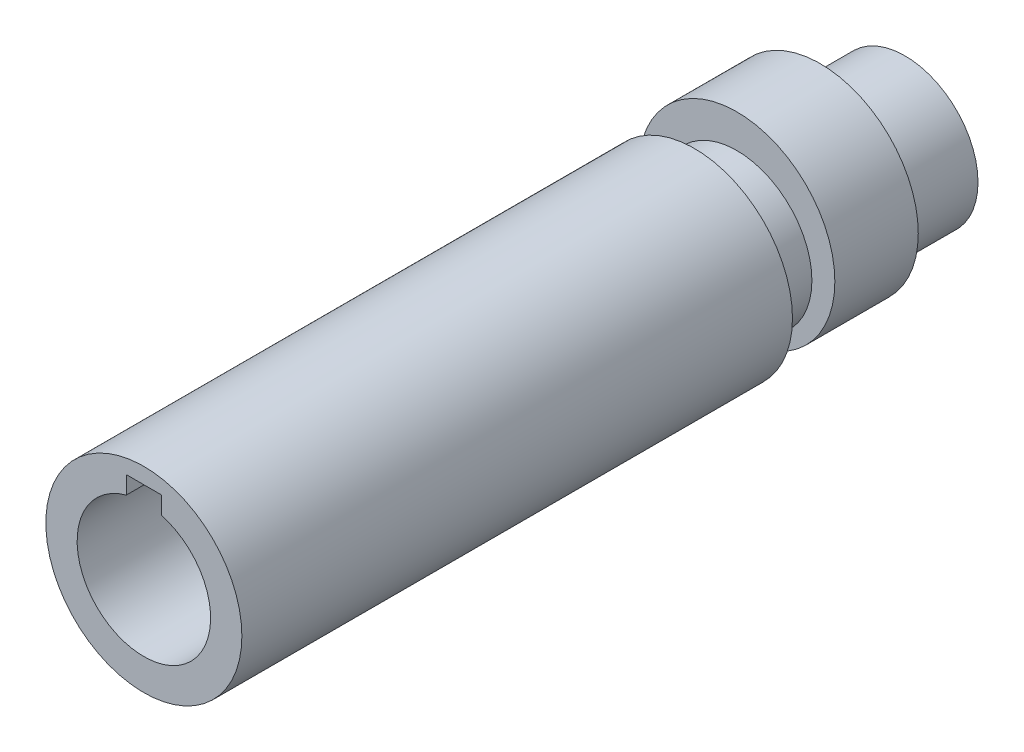
ISO-10303-21;
HEADER;
FILE_DESCRIPTION(('STEP AP214'),'2;1');
FILE_NAME('part.step','',(''),(''),'','','');
FILE_SCHEMA(('AUTOMOTIVE_DESIGN { 1 0 10303 214 1 1 1 1 }'));
ENDSEC;
DATA;
#1=APPLICATION_CONTEXT('core data for automotive mechanical design processes');
#2=APPLICATION_PROTOCOL_DEFINITION('international standard','automotive_design',2000,#1);
#3=PRODUCT_CONTEXT('',#1,'mechanical');
#4=PRODUCT('Part','Part','',(#3));
#5=PRODUCT_RELATED_PRODUCT_CATEGORY('part','',(#4));
#6=PRODUCT_DEFINITION_FORMATION('','',#4);
#7=PRODUCT_DEFINITION_CONTEXT('part definition',#1,'design');
#8=PRODUCT_DEFINITION('design','',#6,#7);
#9=PRODUCT_DEFINITION_SHAPE('','',#8);
#10=(LENGTH_UNIT() NAMED_UNIT(*) SI_UNIT(.MILLI.,.METRE.));
#11=(NAMED_UNIT(*) PLANE_ANGLE_UNIT() SI_UNIT($,.RADIAN.));
#12=(NAMED_UNIT(*) SI_UNIT($,.STERADIAN.) SOLID_ANGLE_UNIT());
#13=UNCERTAINTY_MEASURE_WITH_UNIT(LENGTH_MEASURE(1.E-05),#10,'distance_accuracy_value','');
#14=(GEOMETRIC_REPRESENTATION_CONTEXT(3) GLOBAL_UNCERTAINTY_ASSIGNED_CONTEXT((#13)) GLOBAL_UNIT_ASSIGNED_CONTEXT((#10,
#11,#12)) REPRESENTATION_CONTEXT('',''));
#15=CARTESIAN_POINT('',(0.,0.,0.));
#16=DIRECTION('',(0.,0.,1.));
#17=DIRECTION('',(1.,0.,0.));
#18=AXIS2_PLACEMENT_3D('',#15,#16,#17);
#19=CARTESIAN_POINT('',(0.,0.,0.));
#20=DIRECTION('',(0.,0.,-1.));
#21=DIRECTION('',(1.,0.,0.));
#22=AXIS2_PLACEMENT_3D('',#19,#20,#21);
#23=PLANE('',#22);
#24=CARTESIAN_POINT('',(0.,0.,0.));
#25=DIRECTION('',(0.,0.,1.));
#26=DIRECTION('',(1.,0.,0.));
#27=AXIS2_PLACEMENT_3D('',#24,#25,#26);
#28=CIRCLE('',#27,5.875);
#29=CARTESIAN_POINT('',(5.875,0.,0.));
#30=VERTEX_POINT('',#29);
#31=EDGE_CURVE('E49',#30,#30,#28,.T.);
#32=ORIENTED_EDGE('',*,*,#31,.T.);
#33=EDGE_LOOP('',(#32));
#34=FACE_BOUND('',#33,.T.);
#35=DIRECTION('',(0.,1.,0.));
#36=VECTOR('',#35,1.);
#37=CARTESIAN_POINT('',(1.05,0.,0.));
#38=LINE('',#37,#36);
#39=CARTESIAN_POINT('',(1.05,3.85972796968906,0.));
#40=VERTEX_POINT('',#39);
#41=CARTESIAN_POINT('',(1.05,4.91972796968906,0.));
#42=VERTEX_POINT('',#41);
#43=EDGE_CURVE('E281',#40,#42,#38,.T.);
#44=ORIENTED_EDGE('',*,*,#43,.F.);
#45=CARTESIAN_POINT('',(0.,0.,0.));
#46=DIRECTION('',(0.,0.,-1.));
#47=DIRECTION('',(-1.,0.,0.));
#48=AXIS2_PLACEMENT_3D('',#45,#46,#47);
#49=CIRCLE('',#48,4.);
#50=CARTESIAN_POINT('',(-1.05,3.85972796968906,0.));
#51=VERTEX_POINT('',#50);
#52=EDGE_CURVE('E279',#40,#51,#49,.T.);
#53=ORIENTED_EDGE('',*,*,#52,.T.);
#54=DIRECTION('',(0.,1.,0.));
#55=VECTOR('',#54,1.);
#56=CARTESIAN_POINT('',(-1.05,0.,0.));
#57=LINE('',#56,#55);
#58=CARTESIAN_POINT('',(-1.05,4.91972796968906,0.));
#59=VERTEX_POINT('',#58);
#60=EDGE_CURVE('E108',#51,#59,#57,.T.);
#61=ORIENTED_EDGE('',*,*,#60,.T.);
#62=DIRECTION('',(-1.,0.,0.));
#63=VECTOR('',#62,1.);
#64=CARTESIAN_POINT('',(0.,4.91972796968906,0.));
#65=LINE('',#64,#63);
#66=EDGE_CURVE('E276',#42,#59,#65,.T.);
#67=ORIENTED_EDGE('',*,*,#66,.F.);
#68=EDGE_LOOP('',(#44,#53,#61,#67));
#69=FACE_BOUND('',#68,.T.);
#70=ADVANCED_FACE('F45',(#34,#69),#23,.F.);
#71=CARTESIAN_POINT('',(0.,0.,-33.));
#72=DIRECTION('',(0.,0.,1.));
#73=DIRECTION('',(-1.,0.,0.));
#74=AXIS2_PLACEMENT_3D('',#71,#72,#73);
#75=CYLINDRICAL_SURFACE('',#74,5.875);
#76=CARTESIAN_POINT('',(0.,0.,-33.));
#77=DIRECTION('',(0.,0.,1.));
#78=DIRECTION('',(1.,0.,0.));
#79=AXIS2_PLACEMENT_3D('',#76,#77,#78);
#80=CIRCLE('',#79,5.875);
#81=CARTESIAN_POINT('',(5.875,0.,-33.));
#82=VERTEX_POINT('',#81);
#83=EDGE_CURVE('E129',#82,#82,#80,.T.);
#84=ORIENTED_EDGE('',*,*,#83,.T.);
#85=EDGE_LOOP('',(#84));
#86=FACE_BOUND('',#85,.T.);
#87=ORIENTED_EDGE('',*,*,#31,.F.);
#88=EDGE_LOOP('',(#87));
#89=FACE_BOUND('',#88,.T.);
#90=ADVANCED_FACE('F47',(#86,#89),#75,.T.);
#91=CARTESIAN_POINT('',(0.,0.,-33.));
#92=DIRECTION('',(0.,0.,-1.));
#93=DIRECTION('',(1.,0.,0.));
#94=AXIS2_PLACEMENT_3D('',#91,#92,#93);
#95=PLANE('',#94);
#96=CARTESIAN_POINT('',(0.,0.,-33.));
#97=DIRECTION('',(0.,0.,1.));
#98=DIRECTION('',(1.,0.,0.));
#99=AXIS2_PLACEMENT_3D('',#96,#97,#98);
#100=CIRCLE('',#99,4.5);
#101=CARTESIAN_POINT('',(4.5,0.,-33.));
#102=VERTEX_POINT('',#101);
#103=EDGE_CURVE('E54',#102,#102,#100,.T.);
#104=ORIENTED_EDGE('',*,*,#103,.T.);
#105=EDGE_LOOP('',(#104));
#106=FACE_BOUND('',#105,.T.);
#107=ORIENTED_EDGE('',*,*,#83,.F.);
#108=EDGE_LOOP('',(#107));
#109=FACE_BOUND('',#108,.T.);
#110=ADVANCED_FACE('F139',(#106,#109),#95,.T.);
#111=CARTESIAN_POINT('',(0.,0.,-35.54));
#112=DIRECTION('',(0.,0.,1.));
#113=DIRECTION('',(-1.,0.,0.));
#114=AXIS2_PLACEMENT_3D('',#111,#112,#113);
#115=CYLINDRICAL_SURFACE('',#114,4.5);
#116=CARTESIAN_POINT('',(0.,0.,-35.54));
#117=DIRECTION('',(0.,0.,1.));
#118=DIRECTION('',(1.,0.,0.));
#119=AXIS2_PLACEMENT_3D('',#116,#117,#118);
#120=CIRCLE('',#119,4.5);
#121=CARTESIAN_POINT('',(4.5,0.,-35.54));
#122=VERTEX_POINT('',#121);
#123=EDGE_CURVE('E123',#122,#122,#120,.T.);
#124=ORIENTED_EDGE('',*,*,#123,.T.);
#125=EDGE_LOOP('',(#124));
#126=FACE_BOUND('',#125,.T.);
#127=ORIENTED_EDGE('',*,*,#103,.F.);
#128=EDGE_LOOP('',(#127));
#129=FACE_BOUND('',#128,.T.);
#130=ADVANCED_FACE('F144',(#126,#129),#115,.T.);
#131=CARTESIAN_POINT('',(0.,0.635,-40.54));
#132=DIRECTION('',(0.,0.,1.));
#133=DIRECTION('',(-1.,0.,0.));
#134=AXIS2_PLACEMENT_3D('',#131,#132,#133);
#135=CYLINDRICAL_SURFACE('',#134,5.875);
#136=CARTESIAN_POINT('',(0.,0.635,-40.54));
#137=DIRECTION('',(0.,0.,1.));
#138=DIRECTION('',(1.,0.,0.));
#139=AXIS2_PLACEMENT_3D('',#136,#137,#138);
#140=CIRCLE('',#139,5.875);
#141=CARTESIAN_POINT('',(5.875,0.635,-40.54));
#142=VERTEX_POINT('',#141);
#143=EDGE_CURVE('E120',#142,#142,#140,.T.);
#144=ORIENTED_EDGE('',*,*,#143,.T.);
#145=EDGE_LOOP('',(#144));
#146=FACE_BOUND('',#145,.T.);
#147=CARTESIAN_POINT('',(0.,0.635,-35.54));
#148=DIRECTION('',(0.,0.,1.));
#149=DIRECTION('',(1.,0.,0.));
#150=AXIS2_PLACEMENT_3D('',#147,#148,#149);
#151=CIRCLE('',#150,5.875);
#152=CARTESIAN_POINT('',(5.875,0.635,-35.54));
#153=VERTEX_POINT('',#152);
#154=EDGE_CURVE('E118',#153,#153,#151,.T.);
#155=ORIENTED_EDGE('',*,*,#154,.F.);
#156=EDGE_LOOP('',(#155));
#157=FACE_BOUND('',#156,.T.);
#158=ADVANCED_FACE('F152',(#146,#157),#135,.T.);
#159=CARTESIAN_POINT('',(0.,0.,-40.54));
#160=DIRECTION('',(0.,0.,-1.));
#161=DIRECTION('',(1.,0.,0.));
#162=AXIS2_PLACEMENT_3D('',#159,#160,#161);
#163=PLANE('',#162);
#164=CARTESIAN_POINT('',(0.,0.,-40.54));
#165=DIRECTION('',(0.,0.,1.));
#166=DIRECTION('',(1.,0.,0.));
#167=AXIS2_PLACEMENT_3D('',#164,#165,#166);
#168=CIRCLE('',#167,4.375);
#169=CARTESIAN_POINT('',(4.375,0.,-40.54));
#170=VERTEX_POINT('',#169);
#171=EDGE_CURVE('E11',#170,#170,#168,.T.);
#172=ORIENTED_EDGE('',*,*,#171,.T.);
#173=EDGE_LOOP('',(#172));
#174=FACE_BOUND('',#173,.T.);
#175=ORIENTED_EDGE('',*,*,#143,.F.);
#176=EDGE_LOOP('',(#175));
#177=FACE_BOUND('',#176,.T.);
#178=ADVANCED_FACE('F156',(#174,#177),#163,.T.);
#179=CARTESIAN_POINT('',(0.,0.,-35.54));
#180=DIRECTION('',(0.,0.,-1.));
#181=DIRECTION('',(1.,0.,0.));
#182=AXIS2_PLACEMENT_3D('',#179,#180,#181);
#183=PLANE('',#182);
#184=ORIENTED_EDGE('',*,*,#123,.F.);
#185=EDGE_LOOP('',(#184));
#186=FACE_BOUND('',#185,.T.);
#187=ORIENTED_EDGE('',*,*,#154,.T.);
#188=EDGE_LOOP('',(#187));
#189=FACE_BOUND('',#188,.T.);
#190=ADVANCED_FACE('F158',(#186,#189),#183,.F.);
#191=CARTESIAN_POINT('',(0.,0.,-45.62));
#192=DIRECTION('',(0.,0.,1.));
#193=DIRECTION('',(-1.,0.,0.));
#194=AXIS2_PLACEMENT_3D('',#191,#192,#193);
#195=CYLINDRICAL_SURFACE('',#194,4.375);
#196=CARTESIAN_POINT('',(0.,0.,-45.62));
#197=DIRECTION('',(0.,0.,1.));
#198=DIRECTION('',(1.,0.,0.));
#199=AXIS2_PLACEMENT_3D('',#196,#197,#198);
#200=CIRCLE('',#199,4.375);
#201=CARTESIAN_POINT('',(4.375,0.,-45.62));
#202=VERTEX_POINT('',#201);
#203=EDGE_CURVE('E116',#202,#202,#200,.T.);
#204=ORIENTED_EDGE('',*,*,#203,.T.);
#205=EDGE_LOOP('',(#204));
#206=FACE_BOUND('',#205,.T.);
#207=ORIENTED_EDGE('',*,*,#171,.F.);
#208=EDGE_LOOP('',(#207));
#209=FACE_BOUND('',#208,.T.);
#210=ADVANCED_FACE('F161',(#206,#209),#195,.T.);
#211=CARTESIAN_POINT('',(0.,0.,-45.62));
#212=DIRECTION('',(0.,0.,-1.));
#213=DIRECTION('',(1.,0.,0.));
#214=AXIS2_PLACEMENT_3D('',#211,#212,#213);
#215=PLANE('',#214);
#216=ORIENTED_EDGE('',*,*,#203,.F.);
#217=EDGE_LOOP('',(#216));
#218=FACE_BOUND('',#217,.T.);
#219=ADVANCED_FACE('F168',(#218),#215,.T.);
#220=CARTESIAN_POINT('',(1.05,0.,-31.5));
#221=DIRECTION('',(-1.,0.,0.));
#222=DIRECTION('',(0.,0.,-1.));
#223=AXIS2_PLACEMENT_3D('',#220,#221,#222);
#224=PLANE('',#223);
#225=ORIENTED_EDGE('',*,*,#43,.T.);
#226=DIRECTION('',(0.,0.,1.));
#227=VECTOR('',#226,1.);
#228=CARTESIAN_POINT('',(1.05,4.91972796968906,-31.5));
#229=LINE('',#228,#227);
#230=CARTESIAN_POINT('',(1.05,4.91972796968906,-31.5));
#231=VERTEX_POINT('',#230);
#232=EDGE_CURVE('E87',#231,#42,#229,.T.);
#233=ORIENTED_EDGE('',*,*,#232,.F.);
#234=DIRECTION('',(0.,1.,0.));
#235=VECTOR('',#234,1.);
#236=CARTESIAN_POINT('',(1.05,0.,-31.5));
#237=LINE('',#236,#235);
#238=CARTESIAN_POINT('',(1.05,3.85972796968906,-31.5));
#239=VERTEX_POINT('',#238);
#240=EDGE_CURVE('E101',#239,#231,#237,.T.);
#241=ORIENTED_EDGE('',*,*,#240,.F.);
#242=DIRECTION('',(0.,0.,1.));
#243=VECTOR('',#242,1.);
#244=CARTESIAN_POINT('',(1.05,3.85972796968906,-31.5));
#245=LINE('',#244,#243);
#246=EDGE_CURVE('E62',#239,#40,#245,.T.);
#247=ORIENTED_EDGE('',*,*,#246,.T.);
#248=EDGE_LOOP('',(#225,#233,#241,#247));
#249=FACE_BOUND('',#248,.T.);
#250=ADVANCED_FACE('F172',(#249),#224,.T.);
#251=CARTESIAN_POINT('',(0.,4.91972796968906,-31.5));
#252=DIRECTION('',(0.,-1.,0.));
#253=DIRECTION('',(0.,0.,1.));
#254=AXIS2_PLACEMENT_3D('',#251,#252,#253);
#255=PLANE('',#254);
#256=ORIENTED_EDGE('',*,*,#66,.T.);
#257=DIRECTION('',(0.,0.,1.));
#258=VECTOR('',#257,1.);
#259=CARTESIAN_POINT('',(-1.05,4.91972796968906,-31.5));
#260=LINE('',#259,#258);
#261=CARTESIAN_POINT('',(-1.05,4.91972796968906,-31.5));
#262=VERTEX_POINT('',#261);
#263=EDGE_CURVE('E110',#262,#59,#260,.T.);
#264=ORIENTED_EDGE('',*,*,#263,.F.);
#265=DIRECTION('',(-1.,0.,0.));
#266=VECTOR('',#265,1.);
#267=CARTESIAN_POINT('',(0.,4.91972796968906,-31.5));
#268=LINE('',#267,#266);
#269=EDGE_CURVE('E71',#231,#262,#268,.T.);
#270=ORIENTED_EDGE('',*,*,#269,.F.);
#271=ORIENTED_EDGE('',*,*,#232,.T.);
#272=EDGE_LOOP('',(#256,#264,#270,#271));
#273=FACE_BOUND('',#272,.T.);
#274=ADVANCED_FACE('F176',(#273),#255,.T.);
#275=CARTESIAN_POINT('',(-1.05,0.,-31.5));
#276=DIRECTION('',(-1.,0.,0.));
#277=DIRECTION('',(0.,0.,-1.));
#278=AXIS2_PLACEMENT_3D('',#275,#276,#277);
#279=PLANE('',#278);
#280=ORIENTED_EDGE('',*,*,#60,.F.);
#281=DIRECTION('',(0.,0.,1.));
#282=VECTOR('',#281,1.);
#283=CARTESIAN_POINT('',(-1.05,3.85972796968906,-31.5));
#284=LINE('',#283,#282);
#285=CARTESIAN_POINT('',(-1.05,3.85972796968906,-31.5));
#286=VERTEX_POINT('',#285);
#287=EDGE_CURVE('E98',#286,#51,#284,.T.);
#288=ORIENTED_EDGE('',*,*,#287,.F.);
#289=DIRECTION('',(0.,1.,0.));
#290=VECTOR('',#289,1.);
#291=CARTESIAN_POINT('',(-1.05,0.,-31.5));
#292=LINE('',#291,#290);
#293=EDGE_CURVE('E100',#286,#262,#292,.T.);
#294=ORIENTED_EDGE('',*,*,#293,.T.);
#295=ORIENTED_EDGE('',*,*,#263,.T.);
#296=EDGE_LOOP('',(#280,#288,#294,#295));
#297=FACE_BOUND('',#296,.T.);
#298=ADVANCED_FACE('F106',(#297),#279,.F.);
#299=CARTESIAN_POINT('',(0.,0.,-31.5));
#300=DIRECTION('',(0.,0.,1.));
#301=DIRECTION('',(-1.,0.,0.));
#302=AXIS2_PLACEMENT_3D('',#299,#300,#301);
#303=CYLINDRICAL_SURFACE('',#302,4.);
#304=ORIENTED_EDGE('',*,*,#52,.F.);
#305=ORIENTED_EDGE('',*,*,#246,.F.);
#306=CARTESIAN_POINT('',(0.,0.,-31.5));
#307=DIRECTION('',(0.,0.,-1.));
#308=DIRECTION('',(-1.,0.,0.));
#309=AXIS2_PLACEMENT_3D('',#306,#307,#308);
#310=CIRCLE('',#309,4.);
#311=EDGE_CURVE('E94',#239,#286,#310,.T.);
#312=ORIENTED_EDGE('',*,*,#311,.T.);
#313=ORIENTED_EDGE('',*,*,#287,.T.);
#314=EDGE_LOOP('',(#304,#305,#312,#313));
#315=FACE_BOUND('',#314,.T.);
#316=ADVANCED_FACE('F96',(#315),#303,.F.);
#317=CARTESIAN_POINT('',(0.,0.,-31.5));
#318=DIRECTION('',(0.,0.,1.));
#319=DIRECTION('',(-1.,0.,0.));
#320=AXIS2_PLACEMENT_3D('',#317,#318,#319);
#321=PLANE('',#320);
#322=ORIENTED_EDGE('',*,*,#240,.T.);
#323=ORIENTED_EDGE('',*,*,#269,.T.);
#324=ORIENTED_EDGE('',*,*,#293,.F.);
#325=ORIENTED_EDGE('',*,*,#311,.F.);
#326=EDGE_LOOP('',(#322,#323,#324,#325));
#327=FACE_BOUND('',#326,.T.);
#328=ADVANCED_FACE('F103',(#327),#321,.T.);
#329=CLOSED_SHELL('',(#70,#90,#110,#130,#158,#178,#190,#210,#219,#250,#274,#298,#316,#328));
#330=MANIFOLD_SOLID_BREP('B2',#329);
#331=ADVANCED_BREP_SHAPE_REPRESENTATION('',(#18,#330),#14);
#332=SHAPE_DEFINITION_REPRESENTATION(#9,#331);
ENDSEC;
END-ISO-10303-21;
